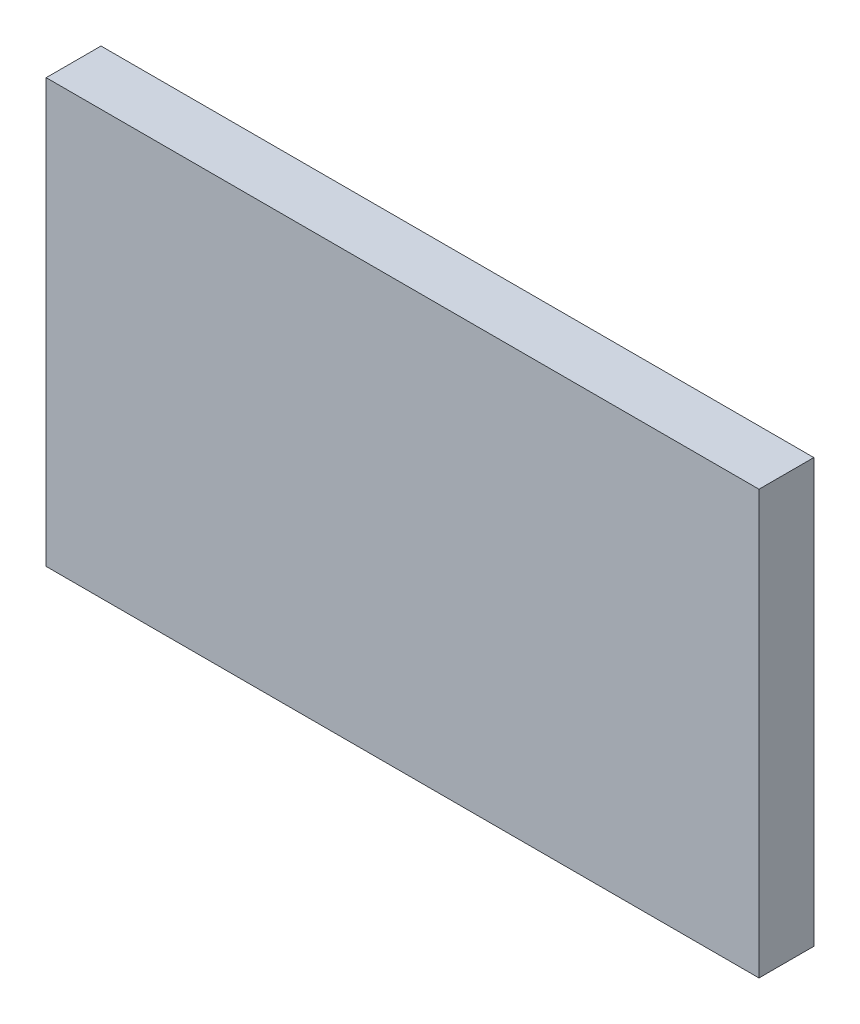
ISO-10303-21;
HEADER;
FILE_DESCRIPTION(('STEP AP214'),'2;1');
FILE_NAME('part.step','',(''),(''),'','','');
FILE_SCHEMA(('AUTOMOTIVE_DESIGN { 1 0 10303 214 1 1 1 1 }'));
ENDSEC;
DATA;
#1=APPLICATION_CONTEXT('core data for automotive mechanical design processes');
#2=APPLICATION_PROTOCOL_DEFINITION('international standard','automotive_design',2000,#1);
#3=PRODUCT_CONTEXT('',#1,'mechanical');
#4=PRODUCT('Part','Part','',(#3));
#5=PRODUCT_RELATED_PRODUCT_CATEGORY('part','',(#4));
#6=PRODUCT_DEFINITION_FORMATION('','',#4);
#7=PRODUCT_DEFINITION_CONTEXT('part definition',#1,'design');
#8=PRODUCT_DEFINITION('design','',#6,#7);
#9=PRODUCT_DEFINITION_SHAPE('','',#8);
#10=(LENGTH_UNIT() NAMED_UNIT(*) SI_UNIT(.MILLI.,.METRE.));
#11=(NAMED_UNIT(*) PLANE_ANGLE_UNIT() SI_UNIT($,.RADIAN.));
#12=(NAMED_UNIT(*) SI_UNIT($,.STERADIAN.) SOLID_ANGLE_UNIT());
#13=UNCERTAINTY_MEASURE_WITH_UNIT(LENGTH_MEASURE(1.E-05),#10,'distance_accuracy_value','');
#14=(GEOMETRIC_REPRESENTATION_CONTEXT(3) GLOBAL_UNCERTAINTY_ASSIGNED_CONTEXT((#13)) GLOBAL_UNIT_ASSIGNED_CONTEXT((#10,
#11,#12)) REPRESENTATION_CONTEXT('',''));
#15=CARTESIAN_POINT('',(0.,0.,0.));
#16=DIRECTION('',(0.,0.,1.));
#17=DIRECTION('',(1.,0.,0.));
#18=AXIS2_PLACEMENT_3D('',#15,#16,#17);
#19=CARTESIAN_POINT('',(162.5,96.5,25.));
#20=DIRECTION('',(1.,0.,0.));
#21=DIRECTION('',(0.,1.,0.));
#22=AXIS2_PLACEMENT_3D('',#19,#20,#21);
#23=PLANE('',#22);
#24=DIRECTION('',(0.,-1.,0.));
#25=VECTOR('',#24,1.);
#26=CARTESIAN_POINT('',(162.5,96.5,0.));
#27=LINE('',#26,#25);
#28=CARTESIAN_POINT('',(162.5,96.5,0.));
#29=VERTEX_POINT('',#28);
#30=CARTESIAN_POINT('',(162.5,-96.5,0.));
#31=VERTEX_POINT('',#30);
#32=EDGE_CURVE('E100',#29,#31,#27,.T.);
#33=ORIENTED_EDGE('',*,*,#32,.F.);
#34=DIRECTION('',(0.,0.,-1.));
#35=VECTOR('',#34,1.);
#36=CARTESIAN_POINT('',(162.5,96.5,25.));
#37=LINE('',#36,#35);
#38=CARTESIAN_POINT('',(162.5,96.5,25.));
#39=VERTEX_POINT('',#38);
#40=EDGE_CURVE('E11',#39,#29,#37,.T.);
#41=ORIENTED_EDGE('',*,*,#40,.F.);
#42=DIRECTION('',(0.,-1.,0.));
#43=VECTOR('',#42,1.);
#44=CARTESIAN_POINT('',(162.5,96.5,25.));
#45=LINE('',#44,#43);
#46=CARTESIAN_POINT('',(162.5,-96.5,25.));
#47=VERTEX_POINT('',#46);
#48=EDGE_CURVE('E95',#39,#47,#45,.T.);
#49=ORIENTED_EDGE('',*,*,#48,.T.);
#50=DIRECTION('',(0.,0.,-1.));
#51=VECTOR('',#50,1.);
#52=CARTESIAN_POINT('',(162.5,-96.5,25.));
#53=LINE('',#52,#51);
#54=EDGE_CURVE('E38',#47,#31,#53,.T.);
#55=ORIENTED_EDGE('',*,*,#54,.T.);
#56=EDGE_LOOP('',(#33,#41,#49,#55));
#57=FACE_BOUND('',#56,.T.);
#58=ADVANCED_FACE('F35',(#57),#23,.T.);
#59=CARTESIAN_POINT('',(162.5,96.5,25.));
#60=DIRECTION('',(0.,-1.,0.));
#61=DIRECTION('',(1.,0.,0.));
#62=AXIS2_PLACEMENT_3D('',#59,#60,#61);
#63=PLANE('',#62);
#64=DIRECTION('',(-1.,0.,0.));
#65=VECTOR('',#64,1.);
#66=CARTESIAN_POINT('',(162.5,96.5,0.));
#67=LINE('',#66,#65);
#68=CARTESIAN_POINT('',(-162.5,96.5,0.));
#69=VERTEX_POINT('',#68);
#70=EDGE_CURVE('E68',#29,#69,#67,.T.);
#71=ORIENTED_EDGE('',*,*,#70,.T.);
#72=DIRECTION('',(0.,0.,-1.));
#73=VECTOR('',#72,1.);
#74=CARTESIAN_POINT('',(-162.5,96.5,25.));
#75=LINE('',#74,#73);
#76=CARTESIAN_POINT('',(-162.5,96.5,25.));
#77=VERTEX_POINT('',#76);
#78=EDGE_CURVE('E44',#77,#69,#75,.T.);
#79=ORIENTED_EDGE('',*,*,#78,.F.);
#80=DIRECTION('',(-1.,0.,0.));
#81=VECTOR('',#80,1.);
#82=CARTESIAN_POINT('',(162.5,96.5,25.));
#83=LINE('',#82,#81);
#84=EDGE_CURVE('E85',#39,#77,#83,.T.);
#85=ORIENTED_EDGE('',*,*,#84,.F.);
#86=ORIENTED_EDGE('',*,*,#40,.T.);
#87=EDGE_LOOP('',(#71,#79,#85,#86));
#88=FACE_BOUND('',#87,.T.);
#89=ADVANCED_FACE('F110',(#88),#63,.F.);
#90=CARTESIAN_POINT('',(-162.5,96.5,25.));
#91=DIRECTION('',(1.,0.,0.));
#92=DIRECTION('',(0.,1.,0.));
#93=AXIS2_PLACEMENT_3D('',#90,#91,#92);
#94=PLANE('',#93);
#95=DIRECTION('',(0.,-1.,0.));
#96=VECTOR('',#95,1.);
#97=CARTESIAN_POINT('',(-162.5,96.5,0.));
#98=LINE('',#97,#96);
#99=CARTESIAN_POINT('',(-162.5,-96.5,0.));
#100=VERTEX_POINT('',#99);
#101=EDGE_CURVE('E92',#69,#100,#98,.T.);
#102=ORIENTED_EDGE('',*,*,#101,.T.);
#103=DIRECTION('',(0.,0.,-1.));
#104=VECTOR('',#103,1.);
#105=CARTESIAN_POINT('',(-162.5,-96.5,25.));
#106=LINE('',#105,#104);
#107=CARTESIAN_POINT('',(-162.5,-96.5,25.));
#108=VERTEX_POINT('',#107);
#109=EDGE_CURVE('E89',#108,#100,#106,.T.);
#110=ORIENTED_EDGE('',*,*,#109,.F.);
#111=DIRECTION('',(0.,-1.,0.));
#112=VECTOR('',#111,1.);
#113=CARTESIAN_POINT('',(-162.5,96.5,25.));
#114=LINE('',#113,#112);
#115=EDGE_CURVE('E80',#77,#108,#114,.T.);
#116=ORIENTED_EDGE('',*,*,#115,.F.);
#117=ORIENTED_EDGE('',*,*,#78,.T.);
#118=EDGE_LOOP('',(#102,#110,#116,#117));
#119=FACE_BOUND('',#118,.T.);
#120=ADVANCED_FACE('F90',(#119),#94,.F.);
#121=CARTESIAN_POINT('',(162.5,-96.5,25.));
#122=DIRECTION('',(0.,-1.,0.));
#123=DIRECTION('',(0.,0.,-1.));
#124=AXIS2_PLACEMENT_3D('',#121,#122,#123);
#125=PLANE('',#124);
#126=DIRECTION('',(-1.,0.,0.));
#127=VECTOR('',#126,1.);
#128=CARTESIAN_POINT('',(162.5,-96.5,0.));
#129=LINE('',#128,#127);
#130=EDGE_CURVE('E103',#31,#100,#129,.T.);
#131=ORIENTED_EDGE('',*,*,#130,.F.);
#132=ORIENTED_EDGE('',*,*,#54,.F.);
#133=DIRECTION('',(-1.,0.,0.));
#134=VECTOR('',#133,1.);
#135=CARTESIAN_POINT('',(162.5,-96.5,25.));
#136=LINE('',#135,#134);
#137=EDGE_CURVE('E84',#47,#108,#136,.T.);
#138=ORIENTED_EDGE('',*,*,#137,.T.);
#139=ORIENTED_EDGE('',*,*,#109,.T.);
#140=EDGE_LOOP('',(#131,#132,#138,#139));
#141=FACE_BOUND('',#140,.T.);
#142=ADVANCED_FACE('F94',(#141),#125,.T.);
#143=CARTESIAN_POINT('',(0.,0.,25.));
#144=DIRECTION('',(0.,0.,-1.));
#145=DIRECTION('',(-1.,0.,0.));
#146=AXIS2_PLACEMENT_3D('',#143,#144,#145);
#147=PLANE('',#146);
#148=ORIENTED_EDGE('',*,*,#48,.F.);
#149=ORIENTED_EDGE('',*,*,#84,.T.);
#150=ORIENTED_EDGE('',*,*,#115,.T.);
#151=ORIENTED_EDGE('',*,*,#137,.F.);
#152=EDGE_LOOP('',(#148,#149,#150,#151));
#153=FACE_BOUND('',#152,.T.);
#154=ADVANCED_FACE('F83',(#153),#147,.F.);
#155=CARTESIAN_POINT('',(0.,0.,0.));
#156=DIRECTION('',(0.,0.,-1.));
#157=DIRECTION('',(-1.,0.,0.));
#158=AXIS2_PLACEMENT_3D('',#155,#156,#157);
#159=PLANE('',#158);
#160=ORIENTED_EDGE('',*,*,#32,.T.);
#161=ORIENTED_EDGE('',*,*,#130,.T.);
#162=ORIENTED_EDGE('',*,*,#101,.F.);
#163=ORIENTED_EDGE('',*,*,#70,.F.);
#164=EDGE_LOOP('',(#160,#161,#162,#163));
#165=FACE_BOUND('',#164,.T.);
#166=ADVANCED_FACE('F108',(#165),#159,.T.);
#167=CLOSED_SHELL('',(#58,#89,#120,#142,#154,#166));
#168=MANIFOLD_SOLID_BREP('B2',#167);
#169=ADVANCED_BREP_SHAPE_REPRESENTATION('',(#18,#168),#14);
#170=SHAPE_DEFINITION_REPRESENTATION(#9,#169);
ENDSEC;
END-ISO-10303-21;
